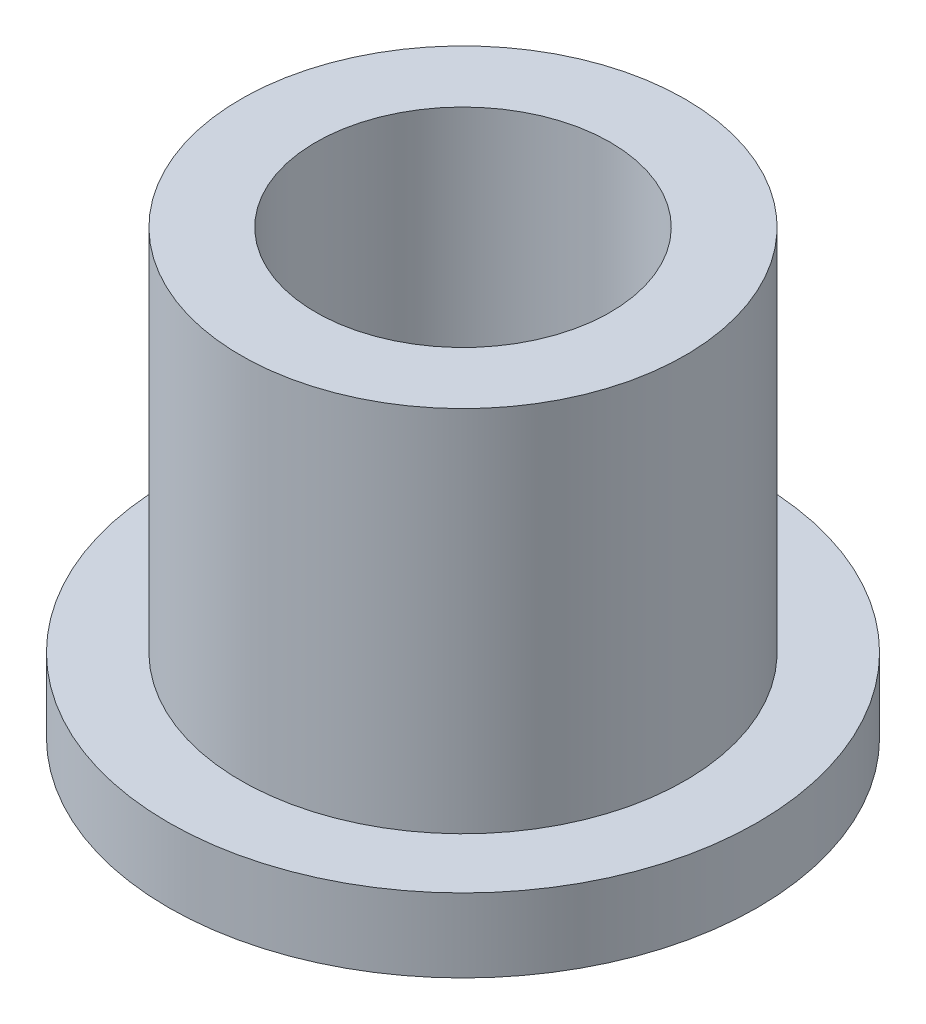
ISO-10303-21;
HEADER;
FILE_DESCRIPTION(('STEP AP214'),'2;1');
FILE_NAME('part.step','',(''),(''),'','','');
FILE_SCHEMA(('AUTOMOTIVE_DESIGN { 1 0 10303 214 1 1 1 1 }'));
ENDSEC;
DATA;
#1=APPLICATION_CONTEXT('core data for automotive mechanical design processes');
#2=APPLICATION_PROTOCOL_DEFINITION('international standard','automotive_design',2000,#1);
#3=PRODUCT_CONTEXT('',#1,'mechanical');
#4=PRODUCT('Part','Part','',(#3));
#5=PRODUCT_RELATED_PRODUCT_CATEGORY('part','',(#4));
#6=PRODUCT_DEFINITION_FORMATION('','',#4);
#7=PRODUCT_DEFINITION_CONTEXT('part definition',#1,'design');
#8=PRODUCT_DEFINITION('design','',#6,#7);
#9=PRODUCT_DEFINITION_SHAPE('','',#8);
#10=(LENGTH_UNIT() NAMED_UNIT(*) SI_UNIT(.MILLI.,.METRE.));
#11=(NAMED_UNIT(*) PLANE_ANGLE_UNIT() SI_UNIT($,.RADIAN.));
#12=(NAMED_UNIT(*) SI_UNIT($,.STERADIAN.) SOLID_ANGLE_UNIT());
#13=UNCERTAINTY_MEASURE_WITH_UNIT(LENGTH_MEASURE(1.E-05),#10,'distance_accuracy_value','');
#14=(GEOMETRIC_REPRESENTATION_CONTEXT(3) GLOBAL_UNCERTAINTY_ASSIGNED_CONTEXT((#13)) GLOBAL_UNIT_ASSIGNED_CONTEXT((#10,
#11,#12)) REPRESENTATION_CONTEXT('',''));
#15=CARTESIAN_POINT('',(0.,0.,0.));
#16=DIRECTION('',(0.,0.,1.));
#17=DIRECTION('',(1.,0.,0.));
#18=AXIS2_PLACEMENT_3D('',#15,#16,#17);
#19=CARTESIAN_POINT('',(0.,9.525,0.));
#20=DIRECTION('',(0.,1.,0.));
#21=DIRECTION('',(0.,0.,1.));
#22=AXIS2_PLACEMENT_3D('',#19,#20,#21);
#23=PLANE('',#22);
#24=CARTESIAN_POINT('',(0.,9.525,0.));
#25=DIRECTION('',(0.,1.,0.));
#26=DIRECTION('',(0.,0.,1.));
#27=AXIS2_PLACEMENT_3D('',#24,#25,#26);
#28=CIRCLE('',#27,4.7879);
#29=CARTESIAN_POINT('',(0.,9.525,-4.7879));
#30=VERTEX_POINT('',#29);
#31=EDGE_CURVE('E10',#30,#30,#28,.T.);
#32=ORIENTED_EDGE('',*,*,#31,.T.);
#33=EDGE_LOOP('',(#32));
#34=FACE_BOUND('',#33,.T.);
#35=CARTESIAN_POINT('',(0.,9.525,0.));
#36=DIRECTION('',(0.,1.,0.));
#37=DIRECTION('',(0.,0.,1.));
#38=AXIS2_PLACEMENT_3D('',#35,#36,#37);
#39=CIRCLE('',#38,3.175);
#40=CARTESIAN_POINT('',(0.,9.525,-3.175));
#41=VERTEX_POINT('',#40);
#42=EDGE_CURVE('E49',#41,#41,#39,.T.);
#43=ORIENTED_EDGE('',*,*,#42,.F.);
#44=EDGE_LOOP('',(#43));
#45=FACE_BOUND('',#44,.T.);
#46=ADVANCED_FACE('F41',(#34,#45),#23,.T.);
#47=CARTESIAN_POINT('',(0.,0.,0.));
#48=DIRECTION('',(0.,1.,0.));
#49=DIRECTION('',(0.,0.,1.));
#50=AXIS2_PLACEMENT_3D('',#47,#48,#49);
#51=PLANE('',#50);
#52=CARTESIAN_POINT('',(0.,0.,0.));
#53=DIRECTION('',(0.,1.,0.));
#54=DIRECTION('',(0.,0.,1.));
#55=AXIS2_PLACEMENT_3D('',#52,#53,#54);
#56=CIRCLE('',#55,3.175);
#57=CARTESIAN_POINT('',(0.,0.,-3.175));
#58=VERTEX_POINT('',#57);
#59=EDGE_CURVE('E54',#58,#58,#56,.T.);
#60=ORIENTED_EDGE('',*,*,#59,.T.);
#61=EDGE_LOOP('',(#60));
#62=FACE_BOUND('',#61,.T.);
#63=CARTESIAN_POINT('',(0.,0.,0.));
#64=DIRECTION('',(0.,1.,0.));
#65=DIRECTION('',(0.,0.,1.));
#66=AXIS2_PLACEMENT_3D('',#63,#64,#65);
#67=CIRCLE('',#66,6.35);
#68=CARTESIAN_POINT('',(0.,0.,6.35));
#69=VERTEX_POINT('',#68);
#70=EDGE_CURVE('E62',#69,#69,#67,.T.);
#71=ORIENTED_EDGE('',*,*,#70,.F.);
#72=EDGE_LOOP('',(#71));
#73=FACE_BOUND('',#72,.T.);
#74=ADVANCED_FACE('F91',(#62,#73),#51,.F.);
#75=CARTESIAN_POINT('',(0.,9.525,0.));
#76=DIRECTION('',(0.,-1.,0.));
#77=DIRECTION('',(0.,0.,-1.));
#78=AXIS2_PLACEMENT_3D('',#75,#76,#77);
#79=CYLINDRICAL_SURFACE('',#78,4.7879);
#80=CARTESIAN_POINT('',(0.,1.5875,0.));
#81=DIRECTION('',(0.,1.,0.));
#82=DIRECTION('',(0.,0.,1.));
#83=AXIS2_PLACEMENT_3D('',#80,#81,#82);
#84=CIRCLE('',#83,4.7879);
#85=CARTESIAN_POINT('',(0.,1.5875,-4.7879));
#86=VERTEX_POINT('',#85);
#87=EDGE_CURVE('E66',#86,#86,#84,.T.);
#88=CARTESIAN_POINT('',(0.,1.5875,-4.7879));
#89=CARTESIAN_POINT('',(0.,1.67018229166667,-4.7879));
#90=CARTESIAN_POINT('',(0.,1.75286458333333,-4.7879));
#91=CARTESIAN_POINT('',(0.,1.91822916666666,-4.7879));
#92=CARTESIAN_POINT('',(0.,2.00091145833333,-4.7879));
#93=CARTESIAN_POINT('',(0.,2.16627604166666,-4.7879));
#94=CARTESIAN_POINT('',(0.,2.24895833333333,-4.7879));
#95=CARTESIAN_POINT('',(0.,2.41432291666667,-4.7879));
#96=CARTESIAN_POINT('',(0.,2.49700520833333,-4.7879));
#97=CARTESIAN_POINT('',(0.,2.66236979166666,-4.7879));
#98=CARTESIAN_POINT('',(0.,2.74505208333333,-4.7879));
#99=CARTESIAN_POINT('',(0.,2.91041666666667,-4.7879));
#100=CARTESIAN_POINT('',(0.,2.99309895833333,-4.7879));
#101=CARTESIAN_POINT('',(0.,3.15846354166667,-4.7879));
#102=CARTESIAN_POINT('',(0.,3.24114583333333,-4.7879));
#103=CARTESIAN_POINT('',(0.,3.40651041666667,-4.7879));
#104=CARTESIAN_POINT('',(0.,3.48919270833333,-4.7879));
#105=CARTESIAN_POINT('',(0.,3.65455729166667,-4.7879));
#106=CARTESIAN_POINT('',(0.,3.73723958333333,-4.7879));
#107=CARTESIAN_POINT('',(0.,3.90260416666667,-4.7879));
#108=CARTESIAN_POINT('',(0.,3.98528645833333,-4.7879));
#109=CARTESIAN_POINT('',(0.,4.15065104166667,-4.7879));
#110=CARTESIAN_POINT('',(0.,4.23333333333333,-4.7879));
#111=CARTESIAN_POINT('',(0.,4.39869791666667,-4.7879));
#112=CARTESIAN_POINT('',(0.,4.48138020833333,-4.7879));
#113=CARTESIAN_POINT('',(0.,4.64674479166667,-4.7879));
#114=CARTESIAN_POINT('',(0.,4.72942708333333,-4.7879));
#115=CARTESIAN_POINT('',(0.,4.89479166666667,-4.7879));
#116=CARTESIAN_POINT('',(0.,4.97747395833333,-4.7879));
#117=CARTESIAN_POINT('',(0.,5.14283854166667,-4.7879));
#118=CARTESIAN_POINT('',(0.,5.22552083333333,-4.7879));
#119=CARTESIAN_POINT('',(0.,5.39088541666667,-4.7879));
#120=CARTESIAN_POINT('',(0.,5.47356770833333,-4.7879));
#121=CARTESIAN_POINT('',(0.,5.63893229166667,-4.7879));
#122=CARTESIAN_POINT('',(0.,5.72161458333333,-4.7879));
#123=CARTESIAN_POINT('',(0.,5.88697916666667,-4.7879));
#124=CARTESIAN_POINT('',(0.,5.96966145833333,-4.7879));
#125=CARTESIAN_POINT('',(0.,6.13502604166667,-4.7879));
#126=CARTESIAN_POINT('',(0.,6.21770833333333,-4.7879));
#127=CARTESIAN_POINT('',(0.,6.38307291666667,-4.7879));
#128=CARTESIAN_POINT('',(0.,6.46575520833333,-4.7879));
#129=CARTESIAN_POINT('',(0.,6.63111979166667,-4.7879));
#130=CARTESIAN_POINT('',(0.,6.71380208333333,-4.7879));
#131=CARTESIAN_POINT('',(0.,6.87916666666667,-4.7879));
#132=CARTESIAN_POINT('',(0.,6.96184895833333,-4.7879));
#133=CARTESIAN_POINT('',(0.,7.12721354166667,-4.7879));
#134=CARTESIAN_POINT('',(0.,7.20989583333333,-4.7879));
#135=CARTESIAN_POINT('',(0.,7.37526041666667,-4.7879));
#136=CARTESIAN_POINT('',(0.,7.45794270833333,-4.7879));
#137=CARTESIAN_POINT('',(0.,7.62330729166667,-4.7879));
#138=CARTESIAN_POINT('',(0.,7.70598958333333,-4.7879));
#139=CARTESIAN_POINT('',(0.,7.87135416666667,-4.7879));
#140=CARTESIAN_POINT('',(0.,7.95403645833333,-4.7879));
#141=CARTESIAN_POINT('',(0.,8.11940104166667,-4.7879));
#142=CARTESIAN_POINT('',(0.,8.20208333333333,-4.7879));
#143=CARTESIAN_POINT('',(0.,8.36744791666667,-4.7879));
#144=CARTESIAN_POINT('',(0.,8.45013020833333,-4.7879));
#145=CARTESIAN_POINT('',(0.,8.61549479166667,-4.7879));
#146=CARTESIAN_POINT('',(0.,8.69817708333333,-4.7879));
#147=CARTESIAN_POINT('',(0.,8.86354166666667,-4.7879));
#148=CARTESIAN_POINT('',(0.,8.94622395833333,-4.7879));
#149=CARTESIAN_POINT('',(0.,9.11158854166667,-4.7879));
#150=CARTESIAN_POINT('',(0.,9.19427083333333,-4.7879));
#151=CARTESIAN_POINT('',(0.,9.35963541666667,-4.7879));
#152=CARTESIAN_POINT('',(0.,9.44231770833333,-4.7879));
#153=CARTESIAN_POINT('',(0.,9.525,-4.7879));
#154=B_SPLINE_CURVE_WITH_KNOTS('',3,(#88,#89,#90,#91,#92,#93,#94,#95,#96,#97,#98,#99,#100,#101,
#102,#103,#104,#105,#106,#107,#108,#109,#110,#111,#112,#113,#114,#115,#116,#117,#118,#119,#120,
#121,#122,#123,#124,#125,#126,#127,#128,#129,#130,#131,#132,#133,#134,#135,#136,#137,#138,#139,
#140,#141,#142,#143,#144,#145,#146,#147,#148,#149,#150,#151,#152,#153),.UNSPECIFIED.,.F.,.F.,(4,
2,2,2,2,2,2,2,2,2,2,2,2,2,2,2,2,2,2,2,2,2,2,2,2,2,2,2,2,2,2,2,4),(0.,0.248046875,
0.496093749999999,0.744140625,0.992187499999999,1.240234375,1.48828125,1.736328125,1.984375,
2.232421875,2.48046875,2.728515625,2.9765625,3.224609375,3.47265625,3.720703125,3.96875,
4.216796875,4.46484375,4.712890625,4.9609375,5.208984375,5.45703125,5.705078125,5.953125,
6.201171875,6.44921875,6.697265625,6.9453125,7.193359375,7.44140625,7.689453125,7.9375),.UNSPECIFIED.);
#155=EDGE_CURVE('BSEAM43',#86,#30,#154,.T.);
#156=ORIENTED_EDGE('',*,*,#87,.T.);
#157=ORIENTED_EDGE('',*,*,#31,.F.);
#158=ORIENTED_EDGE('',*,*,#155,.T.);
#159=ORIENTED_EDGE('',*,*,#155,.F.);
#160=EDGE_LOOP('',(#156,#158,#157,#159));
#161=FACE_BOUND('',#160,.T.);
#162=ADVANCED_FACE('F43',(#161),#79,.T.);
#163=CARTESIAN_POINT('',(0.,9.525,0.));
#164=DIRECTION('',(0.,-1.,0.));
#165=DIRECTION('',(0.,0.,-1.));
#166=AXIS2_PLACEMENT_3D('',#163,#164,#165);
#167=CYLINDRICAL_SURFACE('',#166,3.175);
#168=CARTESIAN_POINT('',(0.,9.525,-3.175));
#169=CARTESIAN_POINT('',(0.,9.42578125,-3.175));
#170=CARTESIAN_POINT('',(0.,9.3265625,-3.175));
#171=CARTESIAN_POINT('',(0.,9.128125,-3.175));
#172=CARTESIAN_POINT('',(0.,9.02890625,-3.175));
#173=CARTESIAN_POINT('',(0.,8.83046875,-3.175));
#174=CARTESIAN_POINT('',(0.,8.73125,-3.175));
#175=CARTESIAN_POINT('',(0.,8.5328125,-3.175));
#176=CARTESIAN_POINT('',(0.,8.43359375,-3.175));
#177=CARTESIAN_POINT('',(0.,8.23515625,-3.175));
#178=CARTESIAN_POINT('',(0.,8.1359375,-3.175));
#179=CARTESIAN_POINT('',(0.,7.9375,-3.175));
#180=CARTESIAN_POINT('',(0.,7.83828125,-3.175));
#181=CARTESIAN_POINT('',(0.,7.63984375,-3.175));
#182=CARTESIAN_POINT('',(0.,7.540625,-3.175));
#183=CARTESIAN_POINT('',(0.,7.3421875,-3.175));
#184=CARTESIAN_POINT('',(0.,7.24296875,-3.175));
#185=CARTESIAN_POINT('',(0.,7.04453125,-3.175));
#186=CARTESIAN_POINT('',(0.,6.9453125,-3.175));
#187=CARTESIAN_POINT('',(0.,6.746875,-3.175));
#188=CARTESIAN_POINT('',(0.,6.64765625,-3.175));
#189=CARTESIAN_POINT('',(0.,6.44921875,-3.175));
#190=CARTESIAN_POINT('',(0.,6.35,-3.175));
#191=CARTESIAN_POINT('',(0.,6.1515625,-3.175));
#192=CARTESIAN_POINT('',(0.,6.05234375,-3.175));
#193=CARTESIAN_POINT('',(0.,5.85390625,-3.175));
#194=CARTESIAN_POINT('',(0.,5.7546875,-3.175));
#195=CARTESIAN_POINT('',(0.,5.55625,-3.175));
#196=CARTESIAN_POINT('',(0.,5.45703125,-3.175));
#197=CARTESIAN_POINT('',(0.,5.25859375,-3.175));
#198=CARTESIAN_POINT('',(0.,5.159375,-3.175));
#199=CARTESIAN_POINT('',(0.,4.9609375,-3.175));
#200=CARTESIAN_POINT('',(0.,4.86171875,-3.175));
#201=CARTESIAN_POINT('',(0.,4.66328125,-3.175));
#202=CARTESIAN_POINT('',(0.,4.5640625,-3.175));
#203=CARTESIAN_POINT('',(0.,4.365625,-3.175));
#204=CARTESIAN_POINT('',(0.,4.26640625,-3.175));
#205=CARTESIAN_POINT('',(0.,4.06796875,-3.175));
#206=CARTESIAN_POINT('',(0.,3.96875,-3.175));
#207=CARTESIAN_POINT('',(0.,3.7703125,-3.175));
#208=CARTESIAN_POINT('',(0.,3.67109375,-3.175));
#209=CARTESIAN_POINT('',(0.,3.47265625,-3.175));
#210=CARTESIAN_POINT('',(0.,3.3734375,-3.175));
#211=CARTESIAN_POINT('',(0.,3.175,-3.175));
#212=CARTESIAN_POINT('',(0.,3.07578125,-3.175));
#213=CARTESIAN_POINT('',(0.,2.87734375,-3.175));
#214=CARTESIAN_POINT('',(0.,2.778125,-3.175));
#215=CARTESIAN_POINT('',(0.,2.5796875,-3.175));
#216=CARTESIAN_POINT('',(0.,2.48046875,-3.175));
#217=CARTESIAN_POINT('',(0.,2.28203125,-3.175));
#218=CARTESIAN_POINT('',(0.,2.1828125,-3.175));
#219=CARTESIAN_POINT('',(0.,1.984375,-3.175));
#220=CARTESIAN_POINT('',(0.,1.88515625,-3.175));
#221=CARTESIAN_POINT('',(0.,1.68671875,-3.175));
#222=CARTESIAN_POINT('',(0.,1.5875,-3.175));
#223=CARTESIAN_POINT('',(0.,1.3890625,-3.175));
#224=CARTESIAN_POINT('',(0.,1.28984375,-3.175));
#225=CARTESIAN_POINT('',(0.,1.09140625,-3.175));
#226=CARTESIAN_POINT('',(0.,0.992187500000001,-3.175));
#227=CARTESIAN_POINT('',(0.,0.793750000000001,-3.175));
#228=CARTESIAN_POINT('',(0.,0.69453125,-3.175));
#229=CARTESIAN_POINT('',(0.,0.49609375,-3.175));
#230=CARTESIAN_POINT('',(0.,0.396875,-3.175));
#231=CARTESIAN_POINT('',(0.,0.1984375,-3.175));
#232=CARTESIAN_POINT('',(0.,0.0992187500000001,-3.175));
#233=CARTESIAN_POINT('',(0.,0.,-3.175));
#234=B_SPLINE_CURVE_WITH_KNOTS('',3,(#168,#169,#170,#171,#172,#173,#174,#175,#176,#177,#178,
#179,#180,#181,#182,#183,#184,#185,#186,#187,#188,#189,#190,#191,#192,#193,#194,#195,#196,#197,
#198,#199,#200,#201,#202,#203,#204,#205,#206,#207,#208,#209,#210,#211,#212,#213,#214,#215,#216,
#217,#218,#219,#220,#221,#222,#223,#224,#225,#226,#227,#228,#229,#230,#231,#232,#233),
.UNSPECIFIED.,.F.,.F.,(4,2,2,2,2,2,2,2,2,2,2,2,2,2,2,2,2,2,2,2,2,2,2,2,2,2,2,2,2,2,2,2,4),(0.,
0.29765625,0.5953125,0.892968750000001,1.190625,1.48828125,1.7859375,2.08359375,2.38125,
2.67890625,2.9765625,3.27421875,3.571875,3.86953125,4.1671875,4.46484375,4.7625,5.06015625,
5.3578125,5.65546875,5.953125,6.25078125,6.5484375,6.84609375,7.14375,7.44140625,7.7390625,
8.03671875,8.334375,8.63203125,8.9296875,9.22734375,9.525),.UNSPECIFIED.);
#235=EDGE_CURVE('BSEAM79',#41,#58,#234,.T.);
#236=ORIENTED_EDGE('',*,*,#42,.T.);
#237=ORIENTED_EDGE('',*,*,#59,.F.);
#238=ORIENTED_EDGE('',*,*,#235,.T.);
#239=ORIENTED_EDGE('',*,*,#235,.F.);
#240=EDGE_LOOP('',(#236,#238,#237,#239));
#241=FACE_BOUND('',#240,.T.);
#242=ADVANCED_FACE('F79',(#241),#167,.F.);
#243=CARTESIAN_POINT('',(0.,1.5875,0.));
#244=DIRECTION('',(0.,1.,0.));
#245=DIRECTION('',(0.,0.,1.));
#246=AXIS2_PLACEMENT_3D('',#243,#244,#245);
#247=PLANE('',#246);
#248=CARTESIAN_POINT('',(0.,1.5875,0.));
#249=DIRECTION('',(0.,1.,0.));
#250=DIRECTION('',(0.,0.,1.));
#251=AXIS2_PLACEMENT_3D('',#248,#249,#250);
#252=CIRCLE('',#251,6.35);
#253=CARTESIAN_POINT('',(0.,1.5875,6.35));
#254=VERTEX_POINT('',#253);
#255=EDGE_CURVE('E60',#254,#254,#252,.T.);
#256=ORIENTED_EDGE('',*,*,#255,.T.);
#257=EDGE_LOOP('',(#256));
#258=FACE_BOUND('',#257,.T.);
#259=ORIENTED_EDGE('',*,*,#87,.F.);
#260=EDGE_LOOP('',(#259));
#261=FACE_BOUND('',#260,.T.);
#262=ADVANCED_FACE('F76',(#258,#261),#247,.T.);
#263=CARTESIAN_POINT('',(0.,1.5875,0.));
#264=DIRECTION('',(0.,-1.,0.));
#265=DIRECTION('',(0.,0.,-1.));
#266=AXIS2_PLACEMENT_3D('',#263,#264,#265);
#267=CYLINDRICAL_SURFACE('',#266,6.35);
#268=ORIENTED_EDGE('',*,*,#255,.F.);
#269=EDGE_LOOP('',(#268));
#270=FACE_BOUND('',#269,.T.);
#271=ORIENTED_EDGE('',*,*,#70,.T.);
#272=EDGE_LOOP('',(#271));
#273=FACE_BOUND('',#272,.T.);
#274=ADVANCED_FACE('F78',(#270,#273),#267,.T.);
#275=CLOSED_SHELL('',(#46,#74,#162,#242,#262,#274));
#276=MANIFOLD_SOLID_BREP('B2',#275);
#277=ADVANCED_BREP_SHAPE_REPRESENTATION('',(#18,#276),#14);
#278=SHAPE_DEFINITION_REPRESENTATION(#9,#277);
ENDSEC;
END-ISO-10303-21;
